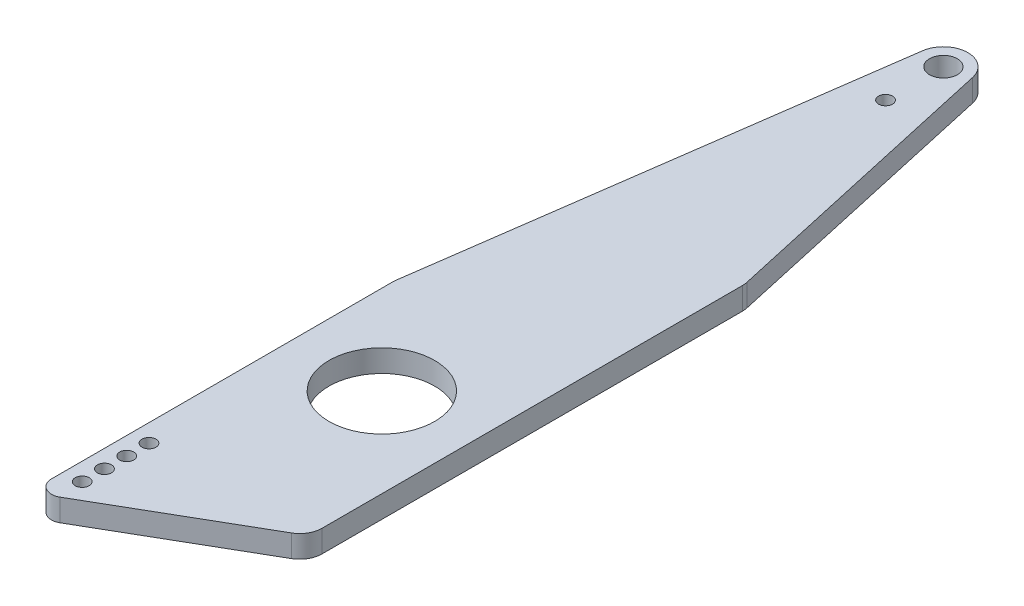
ISO-10303-21;
HEADER;
FILE_DESCRIPTION(('STEP AP214'),'2;1');
FILE_NAME('part.step','',(''),(''),'','','');
FILE_SCHEMA(('AUTOMOTIVE_DESIGN { 1 0 10303 214 1 1 1 1 }'));
ENDSEC;
DATA;
#1=APPLICATION_CONTEXT('core data for automotive mechanical design processes');
#2=APPLICATION_PROTOCOL_DEFINITION('international standard','automotive_design',2000,#1);
#3=PRODUCT_CONTEXT('',#1,'mechanical');
#4=PRODUCT('Part','Part','',(#3));
#5=PRODUCT_RELATED_PRODUCT_CATEGORY('part','',(#4));
#6=PRODUCT_DEFINITION_FORMATION('','',#4);
#7=PRODUCT_DEFINITION_CONTEXT('part definition',#1,'design');
#8=PRODUCT_DEFINITION('design','',#6,#7);
#9=PRODUCT_DEFINITION_SHAPE('','',#8);
#10=(LENGTH_UNIT() NAMED_UNIT(*) SI_UNIT(.MILLI.,.METRE.));
#11=(NAMED_UNIT(*) PLANE_ANGLE_UNIT() SI_UNIT($,.RADIAN.));
#12=(NAMED_UNIT(*) SI_UNIT($,.STERADIAN.) SOLID_ANGLE_UNIT());
#13=UNCERTAINTY_MEASURE_WITH_UNIT(LENGTH_MEASURE(1.E-05),#10,'distance_accuracy_value','');
#14=(GEOMETRIC_REPRESENTATION_CONTEXT(3) GLOBAL_UNCERTAINTY_ASSIGNED_CONTEXT((#13)) GLOBAL_UNIT_ASSIGNED_CONTEXT((#10,
#11,#12)) REPRESENTATION_CONTEXT('',''));
#15=CARTESIAN_POINT('',(0.,0.,0.));
#16=DIRECTION('',(0.,0.,1.));
#17=DIRECTION('',(1.,0.,0.));
#18=AXIS2_PLACEMENT_3D('',#15,#16,#17);
#19=CARTESIAN_POINT('',(-25.4,-6.35,229.105280097995));
#20=DIRECTION('',(-1.,0.,0.));
#21=DIRECTION('',(0.,0.,1.));
#22=AXIS2_PLACEMENT_3D('',#19,#20,#21);
#23=PLANE('',#22);
#24=DIRECTION('',(0.,0.,1.));
#25=VECTOR('',#24,1.);
#26=CARTESIAN_POINT('',(-25.4,-6.35,229.105280097995));
#27=LINE('',#26,#25);
#28=CARTESIAN_POINT('',(-25.4,-6.35,131.27869109805));
#29=VERTEX_POINT('',#28);
#30=CARTESIAN_POINT('',(-25.4,-6.35,197.355280097995));
#31=VERTEX_POINT('',#30);
#32=EDGE_CURVE('E134',#29,#31,#27,.T.);
#33=ORIENTED_EDGE('',*,*,#32,.T.);
#34=DIRECTION('',(0.,1.,0.));
#35=VECTOR('',#34,1.);
#36=CARTESIAN_POINT('',(-25.4,-6.35,197.355280097995));
#37=LINE('',#36,#35);
#38=CARTESIAN_POINT('',(-25.4,0.,197.355280097995));
#39=VERTEX_POINT('',#38);
#40=EDGE_CURVE('E11',#31,#39,#37,.T.);
#41=ORIENTED_EDGE('',*,*,#40,.T.);
#42=DIRECTION('',(0.,0.,1.));
#43=VECTOR('',#42,1.);
#44=CARTESIAN_POINT('',(-25.4,0.,229.105280097995));
#45=LINE('',#44,#43);
#46=CARTESIAN_POINT('',(-25.4,0.,131.27869109805));
#47=VERTEX_POINT('',#46);
#48=EDGE_CURVE('E168',#47,#39,#45,.T.);
#49=ORIENTED_EDGE('',*,*,#48,.F.);
#50=DIRECTION('',(0.,1.,0.));
#51=VECTOR('',#50,1.);
#52=CARTESIAN_POINT('',(-25.4,-6.35,131.27869109805));
#53=LINE('',#52,#51);
#54=EDGE_CURVE('E125',#29,#47,#53,.T.);
#55=ORIENTED_EDGE('',*,*,#54,.F.);
#56=EDGE_LOOP('',(#33,#41,#49,#55));
#57=FACE_BOUND('',#56,.T.);
#58=ADVANCED_FACE('F40',(#57),#23,.T.);
#59=CARTESIAN_POINT('',(-2.73922878190387E-13,-6.35,0.));
#60=DIRECTION('',(0.,1.,0.));
#61=DIRECTION('',(0.,0.,1.));
#62=AXIS2_PLACEMENT_3D('',#59,#60,#61);
#63=CYLINDRICAL_SURFACE('',#62,6.985);
#64=CARTESIAN_POINT('',(-2.73922878190387E-13,0.,0.));
#65=DIRECTION('',(0.,1.,0.));
#66=DIRECTION('',(0.,0.,1.));
#67=AXIS2_PLACEMENT_3D('',#64,#65,#66);
#68=CIRCLE('',#67,6.985);
#69=CARTESIAN_POINT('',(6.81842619825205,0.,-1.51634071995382));
#70=VERTEX_POINT('',#69);
#71=CARTESIAN_POINT('',(-6.9177677348346,0.,-0.966806375072736));
#72=VERTEX_POINT('',#71);
#73=EDGE_CURVE('E163',#70,#72,#68,.T.);
#74=ORIENTED_EDGE('',*,*,#73,.F.);
#75=DIRECTION('',(0.,1.,0.));
#76=VECTOR('',#75,1.);
#77=CARTESIAN_POINT('',(6.81842619825205,-6.35,-1.51634071995382));
#78=LINE('',#77,#76);
#79=CARTESIAN_POINT('',(6.81842619825205,-6.35,-1.51634071995382));
#80=VERTEX_POINT('',#79);
#81=EDGE_CURVE('E49',#80,#70,#78,.T.);
#82=ORIENTED_EDGE('',*,*,#81,.F.);
#83=CARTESIAN_POINT('',(-2.73922878190387E-13,-6.35,0.));
#84=DIRECTION('',(0.,1.,0.));
#85=DIRECTION('',(0.,0.,1.));
#86=AXIS2_PLACEMENT_3D('',#83,#84,#85);
#87=CIRCLE('',#86,6.985);
#88=CARTESIAN_POINT('',(-6.9177677348346,-6.35,-0.966806375072736));
#89=VERTEX_POINT('',#88);
#90=EDGE_CURVE('E132',#80,#89,#87,.T.);
#91=ORIENTED_EDGE('',*,*,#90,.T.);
#92=DIRECTION('',(0.,1.,0.));
#93=VECTOR('',#92,1.);
#94=CARTESIAN_POINT('',(-6.9177677348346,-6.35,-0.966806375072736));
#95=LINE('',#94,#93);
#96=EDGE_CURVE('E115',#89,#72,#95,.T.);
#97=ORIENTED_EDGE('',*,*,#96,.T.);
#98=EDGE_LOOP('',(#74,#82,#91,#97));
#99=FACE_BOUND('',#98,.T.);
#100=ADVANCED_FACE('F42',(#99),#63,.T.);
#101=CARTESIAN_POINT('',(25.2485692711382,-6.35,81.3572303132949));
#102=DIRECTION('',(0.97615264112413,0.,-0.217085285605415));
#103=DIRECTION('',(-0.217085285605415,0.,-0.97615264112413));
#104=AXIS2_PLACEMENT_3D('',#101,#102,#103);
#105=PLANE('',#104);
#106=DIRECTION('',(-0.217085285605415,0.,-0.97615264112413));
#107=VECTOR('',#106,1.);
#108=CARTESIAN_POINT('',(25.2485692711382,0.,81.3572303132949));
#109=LINE('',#108,#107);
#110=CARTESIAN_POINT('',(25.2485692711382,0.,81.3572303132949));
#111=VERTEX_POINT('',#110);
#112=EDGE_CURVE('E137',#111,#70,#109,.T.);
#113=ORIENTED_EDGE('',*,*,#112,.F.);
#114=DIRECTION('',(0.,1.,0.));
#115=VECTOR('',#114,1.);
#116=CARTESIAN_POINT('',(25.2485692711382,-6.35,81.3572303132949));
#117=LINE('',#116,#115);
#118=CARTESIAN_POINT('',(25.2485692711382,-6.35,81.3572303132949));
#119=VERTEX_POINT('',#118);
#120=EDGE_CURVE('E186',#119,#111,#117,.T.);
#121=ORIENTED_EDGE('',*,*,#120,.F.);
#122=DIRECTION('',(-0.217085285605415,0.,-0.97615264112413));
#123=VECTOR('',#122,1.);
#124=CARTESIAN_POINT('',(25.2485692711382,-6.35,81.3572303132949));
#125=LINE('',#124,#123);
#126=EDGE_CURVE('E126',#119,#80,#125,.T.);
#127=ORIENTED_EDGE('',*,*,#126,.T.);
#128=ORIENTED_EDGE('',*,*,#81,.T.);
#129=EDGE_LOOP('',(#113,#121,#127,#128));
#130=FACE_BOUND('',#129,.T.);
#131=ADVANCED_FACE('F204',(#130),#105,.T.);
#132=CARTESIAN_POINT('',(19.05,-6.35,82.7357218768893));
#133=DIRECTION('',(0.,1.,0.));
#134=DIRECTION('',(0.,0.,1.));
#135=AXIS2_PLACEMENT_3D('',#132,#133,#134);
#136=CYLINDRICAL_SURFACE('',#135,6.35);
#137=CARTESIAN_POINT('',(19.05,0.,82.7357218768893));
#138=DIRECTION('',(0.,1.,0.));
#139=DIRECTION('',(0.,0.,-1.));
#140=AXIS2_PLACEMENT_3D('',#137,#138,#139);
#141=CIRCLE('',#140,6.35);
#142=CARTESIAN_POINT('',(25.4,0.,82.7357218768893));
#143=VERTEX_POINT('',#142);
#144=EDGE_CURVE('E140',#143,#111,#141,.T.);
#145=ORIENTED_EDGE('',*,*,#144,.F.);
#146=DIRECTION('',(0.,1.,0.));
#147=VECTOR('',#146,1.);
#148=CARTESIAN_POINT('',(25.4,-6.35,82.7357218768893));
#149=LINE('',#148,#147);
#150=CARTESIAN_POINT('',(25.4,-6.35,82.7357218768893));
#151=VERTEX_POINT('',#150);
#152=EDGE_CURVE('E188',#151,#143,#149,.T.);
#153=ORIENTED_EDGE('',*,*,#152,.F.);
#154=CARTESIAN_POINT('',(19.05,-6.35,82.7357218768893));
#155=DIRECTION('',(0.,1.,0.));
#156=DIRECTION('',(0.,0.,-1.));
#157=AXIS2_PLACEMENT_3D('',#154,#155,#156);
#158=CIRCLE('',#157,6.35);
#159=EDGE_CURVE('E159',#151,#119,#158,.T.);
#160=ORIENTED_EDGE('',*,*,#159,.T.);
#161=ORIENTED_EDGE('',*,*,#120,.T.);
#162=EDGE_LOOP('',(#145,#153,#160,#161));
#163=FACE_BOUND('',#162,.T.);
#164=ADVANCED_FACE('F239',(#163),#136,.T.);
#165=CARTESIAN_POINT('',(25.4,-6.35,82.7357218768893));
#166=DIRECTION('',(1.,0.,0.));
#167=DIRECTION('',(0.,0.,-1.));
#168=AXIS2_PLACEMENT_3D('',#165,#166,#167);
#169=PLANE('',#168);
#170=DIRECTION('',(0.,0.,-1.));
#171=VECTOR('',#170,1.);
#172=CARTESIAN_POINT('',(25.4,0.,82.7357218768893));
#173=LINE('',#172,#171);
#174=CARTESIAN_POINT('',(25.4,0.,202.708825790646));
#175=VERTEX_POINT('',#174);
#176=EDGE_CURVE('E180',#175,#143,#173,.T.);
#177=ORIENTED_EDGE('',*,*,#176,.F.);
#178=DIRECTION('',(0.,1.,0.));
#179=VECTOR('',#178,1.);
#180=CARTESIAN_POINT('',(25.4,-6.35,202.708825790646));
#181=LINE('',#180,#179);
#182=CARTESIAN_POINT('',(25.4,-6.35,202.708825790646));
#183=VERTEX_POINT('',#182);
#184=EDGE_CURVE('E190',#183,#175,#181,.T.);
#185=ORIENTED_EDGE('',*,*,#184,.F.);
#186=DIRECTION('',(0.,0.,-1.));
#187=VECTOR('',#186,1.);
#188=CARTESIAN_POINT('',(25.4,-6.35,82.7357218768893));
#189=LINE('',#188,#187);
#190=EDGE_CURVE('E156',#183,#151,#189,.T.);
#191=ORIENTED_EDGE('',*,*,#190,.T.);
#192=ORIENTED_EDGE('',*,*,#152,.T.);
#193=EDGE_LOOP('',(#177,#185,#191,#192));
#194=FACE_BOUND('',#193,.T.);
#195=ADVANCED_FACE('F211',(#194),#169,.T.);
#196=CARTESIAN_POINT('',(19.05,-6.35,202.708825790646));
#197=DIRECTION('',(0.,1.,0.));
#198=DIRECTION('',(0.,0.,1.));
#199=AXIS2_PLACEMENT_3D('',#196,#197,#198);
#200=CYLINDRICAL_SURFACE('',#199,6.35000000000003);
#201=CARTESIAN_POINT('',(19.05,0.,202.708825790646));
#202=DIRECTION('',(0.,1.,0.));
#203=DIRECTION('',(0.,0.,-1.));
#204=AXIS2_PLACEMENT_3D('',#201,#202,#203);
#205=CIRCLE('',#204,6.35000000000003);
#206=CARTESIAN_POINT('',(22.225,0.,208.208087104677));
#207=VERTEX_POINT('',#206);
#208=EDGE_CURVE('E177',#207,#175,#205,.T.);
#209=ORIENTED_EDGE('',*,*,#208,.F.);
#210=DIRECTION('',(0.,1.,0.));
#211=VECTOR('',#210,1.);
#212=CARTESIAN_POINT('',(22.225,-6.35,208.208087104677));
#213=LINE('',#212,#211);
#214=CARTESIAN_POINT('',(22.225,-6.35,208.208087104677));
#215=VERTEX_POINT('',#214);
#216=EDGE_CURVE('E192',#215,#207,#213,.T.);
#217=ORIENTED_EDGE('',*,*,#216,.F.);
#218=CARTESIAN_POINT('',(19.05,-6.35,202.708825790646));
#219=DIRECTION('',(0.,1.,0.));
#220=DIRECTION('',(0.,0.,-1.));
#221=AXIS2_PLACEMENT_3D('',#218,#219,#220);
#222=CIRCLE('',#221,6.35000000000003);
#223=EDGE_CURVE('E153',#215,#183,#222,.T.);
#224=ORIENTED_EDGE('',*,*,#223,.T.);
#225=ORIENTED_EDGE('',*,*,#184,.T.);
#226=EDGE_LOOP('',(#209,#217,#224,#225));
#227=FACE_BOUND('',#226,.T.);
#228=ADVANCED_FACE('F214',(#227),#200,.T.);
#229=CARTESIAN_POINT('',(22.225,-6.35,208.208087104677));
#230=DIRECTION('',(0.499999999999998,0.,0.86602540378444));
#231=DIRECTION('',(0.86602540378444,0.,-0.499999999999998));
#232=AXIS2_PLACEMENT_3D('',#229,#230,#231);
#233=PLANE('',#232);
#234=DIRECTION('',(0.86602540378444,0.,-0.499999999999998));
#235=VECTOR('',#234,1.);
#236=CARTESIAN_POINT('',(22.225,0.,208.208087104677));
#237=LINE('',#236,#235);
#238=CARTESIAN_POINT('',(-19.685,0.,232.404836886414));
#239=VERTEX_POINT('',#238);
#240=EDGE_CURVE('E174',#239,#207,#237,.T.);
#241=ORIENTED_EDGE('',*,*,#240,.F.);
#242=DIRECTION('',(0.,1.,0.));
#243=VECTOR('',#242,1.);
#244=CARTESIAN_POINT('',(-19.685,-6.35,232.404836886414));
#245=LINE('',#244,#243);
#246=CARTESIAN_POINT('',(-19.685,-6.35,232.404836886414));
#247=VERTEX_POINT('',#246);
#248=EDGE_CURVE('E194',#247,#239,#245,.T.);
#249=ORIENTED_EDGE('',*,*,#248,.F.);
#250=DIRECTION('',(0.86602540378444,0.,-0.499999999999998));
#251=VECTOR('',#250,1.);
#252=CARTESIAN_POINT('',(22.225,-6.35,208.208087104677));
#253=LINE('',#252,#251);
#254=EDGE_CURVE('E150',#247,#215,#253,.T.);
#255=ORIENTED_EDGE('',*,*,#254,.T.);
#256=ORIENTED_EDGE('',*,*,#216,.T.);
#257=EDGE_LOOP('',(#241,#249,#255,#256));
#258=FACE_BOUND('',#257,.T.);
#259=ADVANCED_FACE('F219',(#258),#233,.T.);
#260=CARTESIAN_POINT('',(-21.59,-6.35,229.105280097995));
#261=DIRECTION('',(0.,1.,0.));
#262=DIRECTION('',(0.,0.,1.));
#263=AXIS2_PLACEMENT_3D('',#260,#261,#262);
#264=CYLINDRICAL_SURFACE('',#263,3.81);
#265=CARTESIAN_POINT('',(-21.59,0.,229.105280097995));
#266=DIRECTION('',(0.,1.,0.));
#267=DIRECTION('',(0.,0.,1.));
#268=AXIS2_PLACEMENT_3D('',#265,#266,#267);
#269=CIRCLE('',#268,3.81);
#270=CARTESIAN_POINT('',(-25.4,0.,229.105280097995));
#271=VERTEX_POINT('',#270);
#272=EDGE_CURVE('E171',#271,#239,#269,.T.);
#273=ORIENTED_EDGE('',*,*,#272,.F.);
#274=DIRECTION('',(0.,1.,0.));
#275=VECTOR('',#274,1.);
#276=CARTESIAN_POINT('',(-25.4,-6.35,229.105280097995));
#277=LINE('',#276,#275);
#278=CARTESIAN_POINT('',(-25.4,-6.35,229.105280097995));
#279=VERTEX_POINT('',#278);
#280=EDGE_CURVE('E196',#279,#271,#277,.T.);
#281=ORIENTED_EDGE('',*,*,#280,.F.);
#282=CARTESIAN_POINT('',(-21.59,-6.35,229.105280097995));
#283=DIRECTION('',(0.,1.,0.));
#284=DIRECTION('',(0.,0.,1.));
#285=AXIS2_PLACEMENT_3D('',#282,#283,#284);
#286=CIRCLE('',#285,3.81);
#287=EDGE_CURVE('E147',#279,#247,#286,.T.);
#288=ORIENTED_EDGE('',*,*,#287,.T.);
#289=ORIENTED_EDGE('',*,*,#248,.T.);
#290=EDGE_LOOP('',(#273,#281,#288,#289));
#291=FACE_BOUND('',#290,.T.);
#292=ADVANCED_FACE('F222',(#291),#264,.T.);
#293=ORIENTED_EDGE('',*,*,#40,.F.);
#294=EDGE_CURVE('E135',#31,#279,#27,.T.);
#295=ORIENTED_EDGE('',*,*,#294,.T.);
#296=ORIENTED_EDGE('',*,*,#280,.T.);
#297=EDGE_CURVE('E167',#39,#271,#45,.T.);
#298=ORIENTED_EDGE('',*,*,#297,.F.);
#299=EDGE_LOOP('',(#293,#295,#296,#298));
#300=FACE_BOUND('',#299,.T.);
#301=ADVANCED_FACE('F224',(#300),#23,.T.);
#302=CARTESIAN_POINT('',(-25.4,-6.35,131.27869109805));
#303=DIRECTION('',(-0.990374765187488,0.,-0.138411793138545));
#304=DIRECTION('',(-0.138411793138545,0.,0.990374765187488));
#305=AXIS2_PLACEMENT_3D('',#302,#303,#304);
#306=PLANE('',#305);
#307=DIRECTION('',(-0.138411793138545,0.,0.990374765187488));
#308=VECTOR('',#307,1.);
#309=CARTESIAN_POINT('',(-25.4,0.,131.27869109805));
#310=LINE('',#309,#308);
#311=EDGE_CURVE('E120',#72,#47,#310,.T.);
#312=ORIENTED_EDGE('',*,*,#311,.F.);
#313=ORIENTED_EDGE('',*,*,#96,.F.);
#314=DIRECTION('',(-0.138411793138545,0.,0.990374765187488));
#315=VECTOR('',#314,1.);
#316=CARTESIAN_POINT('',(-25.4,-6.35,131.27869109805));
#317=LINE('',#316,#315);
#318=EDGE_CURVE('E118',#89,#29,#317,.T.);
#319=ORIENTED_EDGE('',*,*,#318,.T.);
#320=ORIENTED_EDGE('',*,*,#54,.T.);
#321=EDGE_LOOP('',(#312,#313,#319,#320));
#322=FACE_BOUND('',#321,.T.);
#323=ADVANCED_FACE('F117',(#322),#306,.T.);
#324=CARTESIAN_POINT('',(-2.73922878190387E-13,-6.35,0.));
#325=DIRECTION('',(0.,1.,0.));
#326=DIRECTION('',(0.,0.,1.));
#327=AXIS2_PLACEMENT_3D('',#324,#325,#326);
#328=PLANE('',#327);
#329=CARTESIAN_POINT('',(0.,-6.35,16.51));
#330=DIRECTION('',(0.,1.,0.));
#331=DIRECTION('',(0.,0.,1.));
#332=AXIS2_PLACEMENT_3D('',#329,#330,#331);
#333=CIRCLE('',#332,2.00000000000026);
#334=CARTESIAN_POINT('',(0.,-6.35,18.5100000000003));
#335=VERTEX_POINT('',#334);
#336=EDGE_CURVE('E416',#335,#335,#333,.T.);
#337=ORIENTED_EDGE('',*,*,#336,.T.);
#338=EDGE_LOOP('',(#337));
#339=FACE_BOUND('',#338,.T.);
#340=CARTESIAN_POINT('',(-20.32,-6.35,206.375));
#341=DIRECTION('',(0.,1.,0.));
#342=DIRECTION('',(0.,0.,1.));
#343=AXIS2_PLACEMENT_3D('',#340,#341,#342);
#344=CIRCLE('',#343,2.00000000000023);
#345=CARTESIAN_POINT('',(-20.32,-6.35,208.375));
#346=VERTEX_POINT('',#345);
#347=EDGE_CURVE('E412',#346,#346,#344,.T.);
#348=ORIENTED_EDGE('',*,*,#347,.T.);
#349=EDGE_LOOP('',(#348));
#350=FACE_BOUND('',#349,.T.);
#351=CARTESIAN_POINT('',(-20.32,-6.35,212.725));
#352=DIRECTION('',(0.,1.,0.));
#353=DIRECTION('',(0.,0.,1.));
#354=AXIS2_PLACEMENT_3D('',#351,#352,#353);
#355=CIRCLE('',#354,2.00000000000023);
#356=CARTESIAN_POINT('',(-20.32,-6.35,214.725));
#357=VERTEX_POINT('',#356);
#358=EDGE_CURVE('E408',#357,#357,#355,.T.);
#359=ORIENTED_EDGE('',*,*,#358,.T.);
#360=EDGE_LOOP('',(#359));
#361=FACE_BOUND('',#360,.T.);
#362=CARTESIAN_POINT('',(-20.32,-6.35,225.425));
#363=DIRECTION('',(0.,1.,0.));
#364=DIRECTION('',(0.,0.,1.));
#365=AXIS2_PLACEMENT_3D('',#362,#363,#364);
#366=CIRCLE('',#365,2.00000000000023);
#367=CARTESIAN_POINT('',(-20.32,-6.35,227.425));
#368=VERTEX_POINT('',#367);
#369=EDGE_CURVE('E404',#368,#368,#366,.T.);
#370=ORIENTED_EDGE('',*,*,#369,.T.);
#371=EDGE_LOOP('',(#370));
#372=FACE_BOUND('',#371,.T.);
#373=CARTESIAN_POINT('',(0.,-6.35,160.246508934012));
#374=DIRECTION('',(0.,1.,0.));
#375=DIRECTION('',(0.,0.,1.));
#376=AXIS2_PLACEMENT_3D('',#373,#374,#375);
#377=CIRCLE('',#376,15.0812500000002);
#378=CARTESIAN_POINT('',(0.,-6.35,175.327758934012));
#379=VERTEX_POINT('',#378);
#380=EDGE_CURVE('E400',#379,#379,#377,.T.);
#381=ORIENTED_EDGE('',*,*,#380,.T.);
#382=EDGE_LOOP('',(#381));
#383=FACE_BOUND('',#382,.T.);
#384=CARTESIAN_POINT('',(-20.32,-6.35,219.075));
#385=DIRECTION('',(0.,1.,0.));
#386=DIRECTION('',(0.,0.,1.));
#387=AXIS2_PLACEMENT_3D('',#384,#385,#386);
#388=CIRCLE('',#387,2.00000000000023);
#389=CARTESIAN_POINT('',(-20.32,-6.35,221.075));
#390=VERTEX_POINT('',#389);
#391=EDGE_CURVE('E394',#390,#390,#388,.T.);
#392=ORIENTED_EDGE('',*,*,#391,.T.);
#393=EDGE_LOOP('',(#392));
#394=FACE_BOUND('',#393,.T.);
#395=CARTESIAN_POINT('',(-2.73922878190387E-13,-6.35,0.));
#396=DIRECTION('',(0.,1.,0.));
#397=DIRECTION('',(0.,0.,1.));
#398=AXIS2_PLACEMENT_3D('',#395,#396,#397);
#399=CIRCLE('',#398,3.96875);
#400=CARTESIAN_POINT('',(-2.73922878190387E-13,-6.35,3.96874999999999));
#401=VERTEX_POINT('',#400);
#402=EDGE_CURVE('E165',#401,#401,#399,.T.);
#403=ORIENTED_EDGE('',*,*,#402,.T.);
#404=EDGE_LOOP('',(#403));
#405=FACE_BOUND('',#404,.T.);
#406=ORIENTED_EDGE('',*,*,#90,.F.);
#407=ORIENTED_EDGE('',*,*,#126,.F.);
#408=ORIENTED_EDGE('',*,*,#159,.F.);
#409=ORIENTED_EDGE('',*,*,#190,.F.);
#410=ORIENTED_EDGE('',*,*,#223,.F.);
#411=ORIENTED_EDGE('',*,*,#254,.F.);
#412=ORIENTED_EDGE('',*,*,#287,.F.);
#413=ORIENTED_EDGE('',*,*,#294,.F.);
#414=ORIENTED_EDGE('',*,*,#32,.F.);
#415=ORIENTED_EDGE('',*,*,#318,.F.);
#416=EDGE_LOOP('',(#406,#407,#408,#409,#410,#411,#412,#413,#414,#415));
#417=FACE_BOUND('',#416,.T.);
#418=ADVANCED_FACE('F130',(#339,#350,#361,#372,#383,#394,#405,#417),#328,.F.);
#419=CARTESIAN_POINT('',(-2.73922878190387E-13,0.,0.));
#420=DIRECTION('',(0.,1.,0.));
#421=DIRECTION('',(0.,0.,1.));
#422=AXIS2_PLACEMENT_3D('',#419,#420,#421);
#423=PLANE('',#422);
#424=CARTESIAN_POINT('',(0.,0.,16.51));
#425=DIRECTION('',(0.,1.,0.));
#426=DIRECTION('',(0.,0.,1.));
#427=AXIS2_PLACEMENT_3D('',#424,#425,#426);
#428=CIRCLE('',#427,2.00000000000026);
#429=CARTESIAN_POINT('',(0.,0.,18.5100000000003));
#430=VERTEX_POINT('',#429);
#431=EDGE_CURVE('E370',#430,#430,#428,.T.);
#432=ORIENTED_EDGE('',*,*,#431,.F.);
#433=EDGE_LOOP('',(#432));
#434=FACE_BOUND('',#433,.T.);
#435=CARTESIAN_POINT('',(-20.32,0.,206.375));
#436=DIRECTION('',(0.,1.,0.));
#437=DIRECTION('',(0.,0.,1.));
#438=AXIS2_PLACEMENT_3D('',#435,#436,#437);
#439=CIRCLE('',#438,2.00000000000023);
#440=CARTESIAN_POINT('',(-20.32,0.,208.375));
#441=VERTEX_POINT('',#440);
#442=EDGE_CURVE('E374',#441,#441,#439,.T.);
#443=ORIENTED_EDGE('',*,*,#442,.F.);
#444=EDGE_LOOP('',(#443));
#445=FACE_BOUND('',#444,.T.);
#446=CARTESIAN_POINT('',(-20.32,0.,212.725));
#447=DIRECTION('',(0.,1.,0.));
#448=DIRECTION('',(0.,0.,1.));
#449=AXIS2_PLACEMENT_3D('',#446,#447,#448);
#450=CIRCLE('',#449,2.00000000000023);
#451=CARTESIAN_POINT('',(-20.32,0.,214.725));
#452=VERTEX_POINT('',#451);
#453=EDGE_CURVE('E378',#452,#452,#450,.T.);
#454=ORIENTED_EDGE('',*,*,#453,.F.);
#455=EDGE_LOOP('',(#454));
#456=FACE_BOUND('',#455,.T.);
#457=CARTESIAN_POINT('',(-20.32,0.,225.425));
#458=DIRECTION('',(0.,1.,0.));
#459=DIRECTION('',(0.,0.,1.));
#460=AXIS2_PLACEMENT_3D('',#457,#458,#459);
#461=CIRCLE('',#460,2.00000000000023);
#462=CARTESIAN_POINT('',(-20.32,0.,227.425));
#463=VERTEX_POINT('',#462);
#464=EDGE_CURVE('E382',#463,#463,#461,.T.);
#465=ORIENTED_EDGE('',*,*,#464,.F.);
#466=EDGE_LOOP('',(#465));
#467=FACE_BOUND('',#466,.T.);
#468=CARTESIAN_POINT('',(0.,0.,160.246508934012));
#469=DIRECTION('',(0.,1.,0.));
#470=DIRECTION('',(0.,0.,1.));
#471=AXIS2_PLACEMENT_3D('',#468,#469,#470);
#472=CIRCLE('',#471,15.0812500000002);
#473=CARTESIAN_POINT('',(0.,0.,175.327758934012));
#474=VERTEX_POINT('',#473);
#475=EDGE_CURVE('E386',#474,#474,#472,.T.);
#476=ORIENTED_EDGE('',*,*,#475,.F.);
#477=EDGE_LOOP('',(#476));
#478=FACE_BOUND('',#477,.T.);
#479=CARTESIAN_POINT('',(-20.32,0.,219.075));
#480=DIRECTION('',(0.,1.,0.));
#481=DIRECTION('',(0.,0.,1.));
#482=AXIS2_PLACEMENT_3D('',#479,#480,#481);
#483=CIRCLE('',#482,2.00000000000023);
#484=CARTESIAN_POINT('',(-20.32,0.,221.075));
#485=VERTEX_POINT('',#484);
#486=EDGE_CURVE('E390',#485,#485,#483,.T.);
#487=ORIENTED_EDGE('',*,*,#486,.F.);
#488=EDGE_LOOP('',(#487));
#489=FACE_BOUND('',#488,.T.);
#490=CARTESIAN_POINT('',(-2.73922878190387E-13,0.,0.));
#491=DIRECTION('',(0.,1.,0.));
#492=DIRECTION('',(0.,0.,1.));
#493=AXIS2_PLACEMENT_3D('',#490,#491,#492);
#494=CIRCLE('',#493,3.96875);
#495=CARTESIAN_POINT('',(-2.73922878190387E-13,0.,3.96874999999999));
#496=VERTEX_POINT('',#495);
#497=EDGE_CURVE('E143',#496,#496,#494,.T.);
#498=ORIENTED_EDGE('',*,*,#497,.F.);
#499=EDGE_LOOP('',(#498));
#500=FACE_BOUND('',#499,.T.);
#501=ORIENTED_EDGE('',*,*,#73,.T.);
#502=ORIENTED_EDGE('',*,*,#311,.T.);
#503=ORIENTED_EDGE('',*,*,#48,.T.);
#504=ORIENTED_EDGE('',*,*,#297,.T.);
#505=ORIENTED_EDGE('',*,*,#272,.T.);
#506=ORIENTED_EDGE('',*,*,#240,.T.);
#507=ORIENTED_EDGE('',*,*,#208,.T.);
#508=ORIENTED_EDGE('',*,*,#176,.T.);
#509=ORIENTED_EDGE('',*,*,#144,.T.);
#510=ORIENTED_EDGE('',*,*,#112,.T.);
#511=EDGE_LOOP('',(#501,#502,#503,#504,#505,#506,#507,#508,#509,#510));
#512=FACE_BOUND('',#511,.T.);
#513=ADVANCED_FACE('F200',(#434,#445,#456,#467,#478,#489,#500,#512),#423,.T.);
#514=CARTESIAN_POINT('',(-2.73922878190387E-13,-6.35,0.));
#515=DIRECTION('',(0.,1.,0.));
#516=DIRECTION('',(0.,0.,1.));
#517=AXIS2_PLACEMENT_3D('',#514,#515,#516);
#518=CYLINDRICAL_SURFACE('',#517,3.96875);
#519=ORIENTED_EDGE('',*,*,#402,.F.);
#520=EDGE_LOOP('',(#519));
#521=FACE_BOUND('',#520,.T.);
#522=ORIENTED_EDGE('',*,*,#497,.T.);
#523=EDGE_LOOP('',(#522));
#524=FACE_BOUND('',#523,.T.);
#525=ADVANCED_FACE('F274',(#521,#524),#518,.F.);
#526=CARTESIAN_POINT('',(-20.32,-6.35,219.075));
#527=DIRECTION('',(0.,1.,0.));
#528=DIRECTION('',(0.,0.,1.));
#529=AXIS2_PLACEMENT_3D('',#526,#527,#528);
#530=CYLINDRICAL_SURFACE('',#529,2.00000000000023);
#531=ORIENTED_EDGE('',*,*,#391,.F.);
#532=EDGE_LOOP('',(#531));
#533=FACE_BOUND('',#532,.T.);
#534=ORIENTED_EDGE('',*,*,#486,.T.);
#535=EDGE_LOOP('',(#534));
#536=FACE_BOUND('',#535,.T.);
#537=ADVANCED_FACE('F279',(#533,#536),#530,.F.);
#538=CARTESIAN_POINT('',(0.,-6.35,160.246508934012));
#539=DIRECTION('',(0.,1.,0.));
#540=DIRECTION('',(0.,0.,1.));
#541=AXIS2_PLACEMENT_3D('',#538,#539,#540);
#542=CYLINDRICAL_SURFACE('',#541,15.0812500000002);
#543=ORIENTED_EDGE('',*,*,#380,.F.);
#544=EDGE_LOOP('',(#543));
#545=FACE_BOUND('',#544,.T.);
#546=ORIENTED_EDGE('',*,*,#475,.T.);
#547=EDGE_LOOP('',(#546));
#548=FACE_BOUND('',#547,.T.);
#549=ADVANCED_FACE('F291',(#545,#548),#542,.F.);
#550=CARTESIAN_POINT('',(-20.32,-6.35,225.425));
#551=DIRECTION('',(0.,1.,0.));
#552=DIRECTION('',(0.,0.,1.));
#553=AXIS2_PLACEMENT_3D('',#550,#551,#552);
#554=CYLINDRICAL_SURFACE('',#553,2.00000000000023);
#555=ORIENTED_EDGE('',*,*,#369,.F.);
#556=EDGE_LOOP('',(#555));
#557=FACE_BOUND('',#556,.T.);
#558=ORIENTED_EDGE('',*,*,#464,.T.);
#559=EDGE_LOOP('',(#558));
#560=FACE_BOUND('',#559,.T.);
#561=ADVANCED_FACE('F301',(#557,#560),#554,.F.);
#562=CARTESIAN_POINT('',(-20.32,-6.35,212.725));
#563=DIRECTION('',(0.,1.,0.));
#564=DIRECTION('',(0.,0.,1.));
#565=AXIS2_PLACEMENT_3D('',#562,#563,#564);
#566=CYLINDRICAL_SURFACE('',#565,2.00000000000023);
#567=ORIENTED_EDGE('',*,*,#358,.F.);
#568=EDGE_LOOP('',(#567));
#569=FACE_BOUND('',#568,.T.);
#570=ORIENTED_EDGE('',*,*,#453,.T.);
#571=EDGE_LOOP('',(#570));
#572=FACE_BOUND('',#571,.T.);
#573=ADVANCED_FACE('F311',(#569,#572),#566,.F.);
#574=CARTESIAN_POINT('',(-20.32,-6.35,206.375));
#575=DIRECTION('',(0.,1.,0.));
#576=DIRECTION('',(0.,0.,1.));
#577=AXIS2_PLACEMENT_3D('',#574,#575,#576);
#578=CYLINDRICAL_SURFACE('',#577,2.00000000000023);
#579=ORIENTED_EDGE('',*,*,#347,.F.);
#580=EDGE_LOOP('',(#579));
#581=FACE_BOUND('',#580,.T.);
#582=ORIENTED_EDGE('',*,*,#442,.T.);
#583=EDGE_LOOP('',(#582));
#584=FACE_BOUND('',#583,.T.);
#585=ADVANCED_FACE('F321',(#581,#584),#578,.F.);
#586=CARTESIAN_POINT('',(0.,-6.35,16.51));
#587=DIRECTION('',(0.,1.,0.));
#588=DIRECTION('',(0.,0.,1.));
#589=AXIS2_PLACEMENT_3D('',#586,#587,#588);
#590=CYLINDRICAL_SURFACE('',#589,2.00000000000026);
#591=ORIENTED_EDGE('',*,*,#336,.F.);
#592=EDGE_LOOP('',(#591));
#593=FACE_BOUND('',#592,.T.);
#594=ORIENTED_EDGE('',*,*,#431,.T.);
#595=EDGE_LOOP('',(#594));
#596=FACE_BOUND('',#595,.T.);
#597=ADVANCED_FACE('F331',(#593,#596),#590,.F.);
#598=CLOSED_SHELL('',(#58,#100,#131,#164,#195,#228,#259,#292,#301,#323,#418,#513,#525,#537,#549,
#561,#573,#585,#597));
#599=MANIFOLD_SOLID_BREP('B2',#598);
#600=ADVANCED_BREP_SHAPE_REPRESENTATION('',(#18,#599),#14);
#601=SHAPE_DEFINITION_REPRESENTATION(#9,#600);
ENDSEC;
END-ISO-10303-21;
